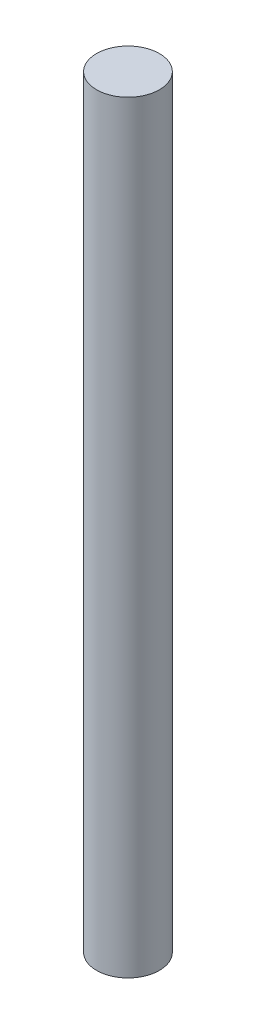
ISO-10303-21;
HEADER;
FILE_DESCRIPTION(('STEP AP214'),'2;1');
FILE_NAME('part.step','',(''),(''),'','','');
FILE_SCHEMA(('AUTOMOTIVE_DESIGN { 1 0 10303 214 1 1 1 1 }'));
ENDSEC;
DATA;
#1=APPLICATION_CONTEXT('core data for automotive mechanical design processes');
#2=APPLICATION_PROTOCOL_DEFINITION('international standard','automotive_design',2000,#1);
#3=PRODUCT_CONTEXT('',#1,'mechanical');
#4=PRODUCT('Part','Part','',(#3));
#5=PRODUCT_RELATED_PRODUCT_CATEGORY('part','',(#4));
#6=PRODUCT_DEFINITION_FORMATION('','',#4);
#7=PRODUCT_DEFINITION_CONTEXT('part definition',#1,'design');
#8=PRODUCT_DEFINITION('design','',#6,#7);
#9=PRODUCT_DEFINITION_SHAPE('','',#8);
#10=(LENGTH_UNIT() NAMED_UNIT(*) SI_UNIT(.MILLI.,.METRE.));
#11=(NAMED_UNIT(*) PLANE_ANGLE_UNIT() SI_UNIT($,.RADIAN.));
#12=(NAMED_UNIT(*) SI_UNIT($,.STERADIAN.) SOLID_ANGLE_UNIT());
#13=UNCERTAINTY_MEASURE_WITH_UNIT(LENGTH_MEASURE(1.E-05),#10,'distance_accuracy_value','');
#14=(GEOMETRIC_REPRESENTATION_CONTEXT(3) GLOBAL_UNCERTAINTY_ASSIGNED_CONTEXT((#13)) GLOBAL_UNIT_ASSIGNED_CONTEXT((#10,
#11,#12)) REPRESENTATION_CONTEXT('',''));
#15=CARTESIAN_POINT('',(0.,0.,0.));
#16=DIRECTION('',(0.,0.,1.));
#17=DIRECTION('',(1.,0.,0.));
#18=AXIS2_PLACEMENT_3D('',#15,#16,#17);
#19=CARTESIAN_POINT('',(5.00000000000047,128.049999999715,221.110489149716));
#20=DIRECTION('',(0.,1.,0.));
#21=DIRECTION('',(0.,0.,-1.));
#22=AXIS2_PLACEMENT_3D('',#19,#20,#21);
#23=PLANE('',#22);
#24=CARTESIAN_POINT('',(0.599683531627364,128.049999999715,225.410489149716));
#25=DIRECTION('',(0.,1.,0.));
#26=DIRECTION('',(0.,0.,1.));
#27=AXIS2_PLACEMENT_3D('',#24,#25,#26);
#28=CIRCLE('',#27,1.75);
#29=CARTESIAN_POINT('',(0.599683531627364,128.049999999715,227.160489149716));
#30=VERTEX_POINT('',#29);
#31=EDGE_CURVE('E11',#30,#30,#28,.T.);
#32=ORIENTED_EDGE('',*,*,#31,.T.);
#33=EDGE_LOOP('',(#32));
#34=FACE_BOUND('',#33,.T.);
#35=ADVANCED_FACE('F42',(#34),#23,.T.);
#36=CARTESIAN_POINT('',(15.5000000000004,85.549999999715,220.910489149716));
#37=DIRECTION('',(0.,-1.,0.));
#38=DIRECTION('',(0.,0.,-1.));
#39=AXIS2_PLACEMENT_3D('',#36,#37,#38);
#40=PLANE('',#39);
#41=CARTESIAN_POINT('',(0.599683531627405,85.549999999715,225.410489149716));
#42=DIRECTION('',(0.,1.,0.));
#43=DIRECTION('',(-1.,0.,0.));
#44=AXIS2_PLACEMENT_3D('',#41,#42,#43);
#45=CIRCLE('',#44,1.75);
#46=CARTESIAN_POINT('',(-1.1503164683726,85.549999999715,225.410489149716));
#47=VERTEX_POINT('',#46);
#48=EDGE_CURVE('E46',#47,#47,#45,.T.);
#49=ORIENTED_EDGE('',*,*,#48,.F.);
#50=EDGE_LOOP('',(#49));
#51=FACE_BOUND('',#50,.T.);
#52=ADVANCED_FACE('F44',(#51),#40,.T.);
#53=CARTESIAN_POINT('',(0.599683531627435,53.049999999715,225.410489149716));
#54=DIRECTION('',(0.,1.,0.));
#55=DIRECTION('',(-1.,0.,0.));
#56=AXIS2_PLACEMENT_3D('',#53,#54,#55);
#57=CYLINDRICAL_SURFACE('',#56,1.75);
#58=ORIENTED_EDGE('',*,*,#31,.F.);
#59=EDGE_LOOP('',(#58));
#60=FACE_BOUND('',#59,.T.);
#61=ORIENTED_EDGE('',*,*,#48,.T.);
#62=EDGE_LOOP('',(#61));
#63=FACE_BOUND('',#62,.T.);
#64=ADVANCED_FACE('F64',(#60,#63),#57,.T.);
#65=CLOSED_SHELL('',(#35,#52,#64));
#66=MANIFOLD_SOLID_BREP('B2',#65);
#67=ADVANCED_BREP_SHAPE_REPRESENTATION('',(#18,#66),#14);
#68=SHAPE_DEFINITION_REPRESENTATION(#9,#67);
ENDSEC;
END-ISO-10303-21;
